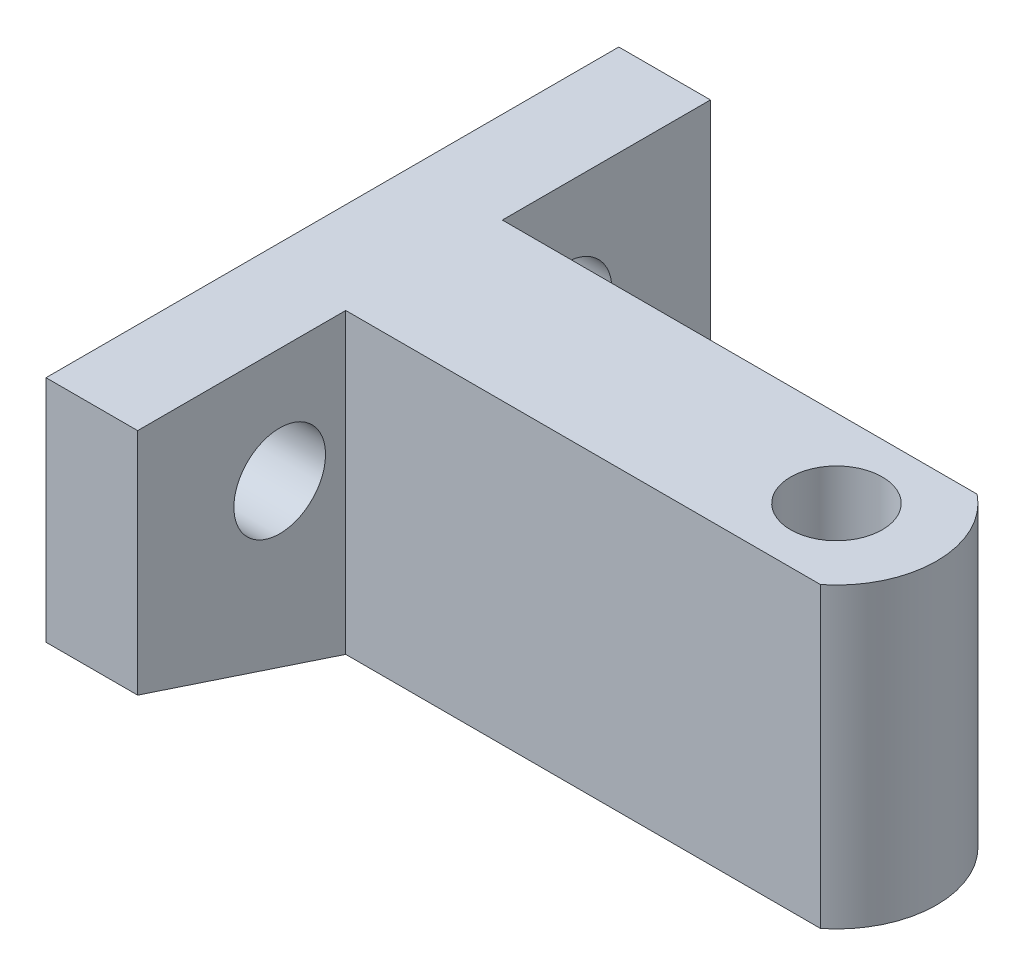
ISO-10303-21;
HEADER;
FILE_DESCRIPTION(('STEP AP214'),'2;1');
FILE_NAME('part.step','',(''),(''),'','','');
FILE_SCHEMA(('AUTOMOTIVE_DESIGN { 1 0 10303 214 1 1 1 1 }'));
ENDSEC;
DATA;
#1=APPLICATION_CONTEXT('core data for automotive mechanical design processes');
#2=APPLICATION_PROTOCOL_DEFINITION('international standard','automotive_design',2000,#1);
#3=PRODUCT_CONTEXT('',#1,'mechanical');
#4=PRODUCT('Part','Part','',(#3));
#5=PRODUCT_RELATED_PRODUCT_CATEGORY('part','',(#4));
#6=PRODUCT_DEFINITION_FORMATION('','',#4);
#7=PRODUCT_DEFINITION_CONTEXT('part definition',#1,'design');
#8=PRODUCT_DEFINITION('design','',#6,#7);
#9=PRODUCT_DEFINITION_SHAPE('','',#8);
#10=(LENGTH_UNIT() NAMED_UNIT(*) SI_UNIT(.MILLI.,.METRE.));
#11=(NAMED_UNIT(*) PLANE_ANGLE_UNIT() SI_UNIT($,.RADIAN.));
#12=(NAMED_UNIT(*) SI_UNIT($,.STERADIAN.) SOLID_ANGLE_UNIT());
#13=UNCERTAINTY_MEASURE_WITH_UNIT(LENGTH_MEASURE(1.E-05),#10,'distance_accuracy_value','');
#14=(GEOMETRIC_REPRESENTATION_CONTEXT(3) GLOBAL_UNCERTAINTY_ASSIGNED_CONTEXT((#13)) GLOBAL_UNIT_ASSIGNED_CONTEXT((#10,
#11,#12)) REPRESENTATION_CONTEXT('',''));
#15=CARTESIAN_POINT('',(0.,0.,0.));
#16=DIRECTION('',(0.,0.,1.));
#17=DIRECTION('',(1.,0.,0.));
#18=AXIS2_PLACEMENT_3D('',#15,#16,#17);
#19=CARTESIAN_POINT('',(4.,0.,0.));
#20=DIRECTION('',(-1.,0.,0.));
#21=DIRECTION('',(0.,0.,1.));
#22=AXIS2_PLACEMENT_3D('',#19,#20,#21);
#23=PLANE('',#22);
#24=CARTESIAN_POINT('',(4.,5.12731481481481,-13.5589810604167));
#25=DIRECTION('',(1.,0.,0.));
#26=DIRECTION('',(0.,0.,-1.));
#27=AXIS2_PLACEMENT_3D('',#24,#25,#26);
#28=CIRCLE('',#27,2.);
#29=CARTESIAN_POINT('',(4.,5.12731481481481,-15.5589810604167));
#30=VERTEX_POINT('',#29);
#31=EDGE_CURVE('E122',#30,#30,#28,.T.);
#32=ORIENTED_EDGE('',*,*,#31,.F.);
#33=EDGE_LOOP('',(#32));
#34=FACE_BOUND('',#33,.T.);
#35=DIRECTION('',(0.,1.,0.));
#36=VECTOR('',#35,1.);
#37=CARTESIAN_POINT('',(4.,-2.87268518518519,-10.7765357543478));
#38=LINE('',#37,#36);
#39=CARTESIAN_POINT('',(4.,-2.87268518518519,-10.7765357543478));
#40=VERTEX_POINT('',#39);
#41=CARTESIAN_POINT('',(4.,10.1273148148148,-10.7765357543478));
#42=VERTEX_POINT('',#41);
#43=EDGE_CURVE('E40',#40,#42,#38,.T.);
#44=ORIENTED_EDGE('',*,*,#43,.F.);
#45=DIRECTION('',(0.,0.313640770390582,-0.949541714275261));
#46=VECTOR('',#45,1.);
#47=CARTESIAN_POINT('',(4.,-2.87268518518519,-10.7765357543478));
#48=LINE('',#47,#46);
#49=CARTESIAN_POINT('',(4.,0.127314814814814,-19.8589810604167));
#50=VERTEX_POINT('',#49);
#51=EDGE_CURVE('E199',#40,#50,#48,.T.);
#52=ORIENTED_EDGE('',*,*,#51,.T.);
#53=DIRECTION('',(0.,1.,0.));
#54=VECTOR('',#53,1.);
#55=CARTESIAN_POINT('',(4.,0.127314814814814,-19.8589810604167));
#56=LINE('',#55,#54);
#57=CARTESIAN_POINT('',(4.,10.1273148148148,-19.8589810604167));
#58=VERTEX_POINT('',#57);
#59=EDGE_CURVE('E140',#50,#58,#56,.T.);
#60=ORIENTED_EDGE('',*,*,#59,.T.);
#61=DIRECTION('',(0.,0.,1.));
#62=VECTOR('',#61,1.);
#63=CARTESIAN_POINT('',(4.,10.1273148148148,5.14101893958334));
#64=LINE('',#63,#62);
#65=EDGE_CURVE('E144',#58,#42,#64,.T.);
#66=ORIENTED_EDGE('',*,*,#65,.T.);
#67=EDGE_LOOP('',(#44,#52,#60,#66));
#68=FACE_BOUND('',#67,.T.);
#69=ADVANCED_FACE('F32',(#34,#68),#23,.F.);
#70=CARTESIAN_POINT('',(4.,5.12731481481481,-1.05898106041667));
#71=DIRECTION('',(1.,0.,0.));
#72=DIRECTION('',(0.,0.,-1.));
#73=AXIS2_PLACEMENT_3D('',#70,#71,#72);
#74=CIRCLE('',#73,2.);
#75=CARTESIAN_POINT('',(4.,5.12731481481481,-3.05898106041667));
#76=VERTEX_POINT('',#75);
#77=EDGE_CURVE('E131',#76,#76,#74,.T.);
#78=ORIENTED_EDGE('',*,*,#77,.F.);
#79=EDGE_LOOP('',(#78));
#80=FACE_BOUND('',#79,.T.);
#81=DIRECTION('',(0.,-1.,0.));
#82=VECTOR('',#81,1.);
#83=CARTESIAN_POINT('',(4.,-2.87268518518519,-3.94142636648558));
#84=LINE('',#83,#82);
#85=CARTESIAN_POINT('',(4.,10.1273148148148,-3.94142636648558));
#86=VERTEX_POINT('',#85);
#87=CARTESIAN_POINT('',(4.,-2.87268518518519,-3.94142636648558));
#88=VERTEX_POINT('',#87);
#89=EDGE_CURVE('E163',#86,#88,#84,.T.);
#90=ORIENTED_EDGE('',*,*,#89,.F.);
#91=CARTESIAN_POINT('',(4.,10.1273148148148,5.14101893958334));
#92=VERTEX_POINT('',#91);
#93=EDGE_CURVE('E143',#86,#92,#64,.T.);
#94=ORIENTED_EDGE('',*,*,#93,.T.);
#95=DIRECTION('',(0.,-1.,0.));
#96=VECTOR('',#95,1.);
#97=CARTESIAN_POINT('',(4.,0.127314814814814,5.14101893958334));
#98=LINE('',#97,#96);
#99=CARTESIAN_POINT('',(4.,0.127314814814814,5.14101893958334));
#100=VERTEX_POINT('',#99);
#101=EDGE_CURVE('E137',#92,#100,#98,.T.);
#102=ORIENTED_EDGE('',*,*,#101,.T.);
#103=DIRECTION('',(0.,-0.313640770390583,-0.949541714275261));
#104=VECTOR('',#103,1.);
#105=CARTESIAN_POINT('',(4.,0.127314814814814,5.14101893958334));
#106=LINE('',#105,#104);
#107=EDGE_CURVE('E192',#100,#88,#106,.T.);
#108=ORIENTED_EDGE('',*,*,#107,.T.);
#109=EDGE_LOOP('',(#90,#94,#102,#108));
#110=FACE_BOUND('',#109,.T.);
#111=ADVANCED_FACE('F196',(#80,#110),#23,.F.);
#112=CARTESIAN_POINT('',(0.,0.,0.));
#113=DIRECTION('',(-1.,0.,0.));
#114=DIRECTION('',(0.,0.,1.));
#115=AXIS2_PLACEMENT_3D('',#112,#113,#114);
#116=PLANE('',#115);
#117=CARTESIAN_POINT('',(0.,5.12731481481481,-1.05898106041667));
#118=DIRECTION('',(1.,0.,0.));
#119=DIRECTION('',(0.,0.,-1.));
#120=AXIS2_PLACEMENT_3D('',#117,#118,#119);
#121=CIRCLE('',#120,2.);
#122=CARTESIAN_POINT('',(0.,5.12731481481481,-3.05898106041667));
#123=VERTEX_POINT('',#122);
#124=EDGE_CURVE('E129',#123,#123,#121,.T.);
#125=ORIENTED_EDGE('',*,*,#124,.T.);
#126=EDGE_LOOP('',(#125));
#127=FACE_BOUND('',#126,.T.);
#128=DIRECTION('',(0.,-1.,0.));
#129=VECTOR('',#128,1.);
#130=CARTESIAN_POINT('',(0.,0.127314814814814,5.14101893958334));
#131=LINE('',#130,#129);
#132=CARTESIAN_POINT('',(0.,10.1273148148148,5.14101893958334));
#133=VERTEX_POINT('',#132);
#134=CARTESIAN_POINT('',(0.,0.127314814814814,5.14101893958334));
#135=VERTEX_POINT('',#134);
#136=EDGE_CURVE('E134',#133,#135,#131,.T.);
#137=ORIENTED_EDGE('',*,*,#136,.F.);
#138=DIRECTION('',(0.,0.,1.));
#139=VECTOR('',#138,1.);
#140=CARTESIAN_POINT('',(0.,10.1273148148148,5.14101893958334));
#141=LINE('',#140,#139);
#142=CARTESIAN_POINT('',(0.,10.1273148148148,-19.8589810604167));
#143=VERTEX_POINT('',#142);
#144=EDGE_CURVE('E141',#143,#133,#141,.T.);
#145=ORIENTED_EDGE('',*,*,#144,.F.);
#146=DIRECTION('',(0.,1.,0.));
#147=VECTOR('',#146,1.);
#148=CARTESIAN_POINT('',(0.,0.127314814814814,-19.8589810604167));
#149=LINE('',#148,#147);
#150=CARTESIAN_POINT('',(0.,0.127314814814814,-19.8589810604167));
#151=VERTEX_POINT('',#150);
#152=EDGE_CURVE('E149',#151,#143,#149,.T.);
#153=ORIENTED_EDGE('',*,*,#152,.F.);
#154=DIRECTION('',(0.,0.313640770390582,-0.949541714275261));
#155=VECTOR('',#154,1.);
#156=CARTESIAN_POINT('',(0.,-2.87268518518519,-10.7765357543478));
#157=LINE('',#156,#155);
#158=CARTESIAN_POINT('',(0.,-2.87268518518519,-10.7765357543478));
#159=VERTEX_POINT('',#158);
#160=EDGE_CURVE('E195',#159,#151,#157,.T.);
#161=ORIENTED_EDGE('',*,*,#160,.F.);
#162=DIRECTION('',(0.,0.,-1.));
#163=VECTOR('',#162,1.);
#164=CARTESIAN_POINT('',(0.,-2.87268518518519,-3.94142636648558));
#165=LINE('',#164,#163);
#166=CARTESIAN_POINT('',(0.,-2.87268518518519,-3.94142636648558));
#167=VERTEX_POINT('',#166);
#168=EDGE_CURVE('E206',#167,#159,#165,.T.);
#169=ORIENTED_EDGE('',*,*,#168,.F.);
#170=DIRECTION('',(0.,-0.313640770390583,-0.949541714275261));
#171=VECTOR('',#170,1.);
#172=CARTESIAN_POINT('',(0.,0.127314814814814,5.14101893958334));
#173=LINE('',#172,#171);
#174=EDGE_CURVE('E194',#135,#167,#173,.T.);
#175=ORIENTED_EDGE('',*,*,#174,.F.);
#176=EDGE_LOOP('',(#137,#145,#153,#161,#169,#175));
#177=FACE_BOUND('',#176,.T.);
#178=CARTESIAN_POINT('',(0.,5.12731481481481,-13.5589810604167));
#179=DIRECTION('',(1.,0.,0.));
#180=DIRECTION('',(0.,0.,-1.));
#181=AXIS2_PLACEMENT_3D('',#178,#179,#180);
#182=CIRCLE('',#181,2.);
#183=CARTESIAN_POINT('',(0.,5.12731481481481,-15.5589810604167));
#184=VERTEX_POINT('',#183);
#185=EDGE_CURVE('E119',#184,#184,#182,.T.);
#186=ORIENTED_EDGE('',*,*,#185,.T.);
#187=EDGE_LOOP('',(#186));
#188=FACE_BOUND('',#187,.T.);
#189=ADVANCED_FACE('F212',(#127,#177,#188),#116,.T.);
#190=CARTESIAN_POINT('',(4.,0.127314814814814,5.14101893958334));
#191=DIRECTION('',(0.,0.,-1.));
#192=DIRECTION('',(0.,1.,0.));
#193=AXIS2_PLACEMENT_3D('',#190,#191,#192);
#194=PLANE('',#193);
#195=ORIENTED_EDGE('',*,*,#136,.T.);
#196=DIRECTION('',(-1.,0.,0.));
#197=VECTOR('',#196,1.);
#198=CARTESIAN_POINT('',(4.,0.127314814814814,5.14101893958334));
#199=LINE('',#198,#197);
#200=EDGE_CURVE('E160',#100,#135,#199,.T.);
#201=ORIENTED_EDGE('',*,*,#200,.F.);
#202=ORIENTED_EDGE('',*,*,#101,.F.);
#203=DIRECTION('',(-1.,0.,0.));
#204=VECTOR('',#203,1.);
#205=CARTESIAN_POINT('',(4.,10.1273148148148,5.14101893958334));
#206=LINE('',#205,#204);
#207=EDGE_CURVE('E146',#92,#133,#206,.T.);
#208=ORIENTED_EDGE('',*,*,#207,.T.);
#209=EDGE_LOOP('',(#195,#201,#202,#208));
#210=FACE_BOUND('',#209,.T.);
#211=ADVANCED_FACE('F34',(#210),#194,.F.);
#212=CARTESIAN_POINT('',(4.,0.127314814814814,-19.8589810604167));
#213=DIRECTION('',(0.,0.,1.));
#214=DIRECTION('',(1.,0.,0.));
#215=AXIS2_PLACEMENT_3D('',#212,#213,#214);
#216=PLANE('',#215);
#217=ORIENTED_EDGE('',*,*,#152,.T.);
#218=DIRECTION('',(-1.,0.,0.));
#219=VECTOR('',#218,1.);
#220=CARTESIAN_POINT('',(4.,10.1273148148148,-19.8589810604167));
#221=LINE('',#220,#219);
#222=EDGE_CURVE('E154',#58,#143,#221,.T.);
#223=ORIENTED_EDGE('',*,*,#222,.F.);
#224=ORIENTED_EDGE('',*,*,#59,.F.);
#225=DIRECTION('',(-1.,0.,0.));
#226=VECTOR('',#225,1.);
#227=CARTESIAN_POINT('',(4.,0.127314814814814,-19.8589810604167));
#228=LINE('',#227,#226);
#229=EDGE_CURVE('E157',#50,#151,#228,.T.);
#230=ORIENTED_EDGE('',*,*,#229,.T.);
#231=EDGE_LOOP('',(#217,#223,#224,#230));
#232=FACE_BOUND('',#231,.T.);
#233=ADVANCED_FACE('F220',(#232),#216,.F.);
#234=CARTESIAN_POINT('',(4.,10.1273148148148,5.14101893958334));
#235=DIRECTION('',(0.,-1.,0.));
#236=DIRECTION('',(0.,0.,-1.));
#237=AXIS2_PLACEMENT_3D('',#234,#235,#236);
#238=PLANE('',#237);
#239=CARTESIAN_POINT('',(22.,10.1273148148148,-7.35898106041667));
#240=DIRECTION('',(0.,1.,0.));
#241=DIRECTION('',(0.,0.,1.));
#242=AXIS2_PLACEMENT_3D('',#239,#240,#241);
#243=CIRCLE('',#242,2.);
#244=CARTESIAN_POINT('',(22.,10.1273148148148,-5.35898106041667));
#245=VERTEX_POINT('',#244);
#246=EDGE_CURVE('E164',#245,#245,#243,.T.);
#247=ORIENTED_EDGE('',*,*,#246,.F.);
#248=EDGE_LOOP('',(#247));
#249=FACE_BOUND('',#248,.T.);
#250=DIRECTION('',(-1.,0.,0.));
#251=VECTOR('',#250,1.);
#252=CARTESIAN_POINT('',(28.,10.1273148148148,-3.94142636648558));
#253=LINE('',#252,#251);
#254=CARTESIAN_POINT('',(24.720702873678,10.1273148148148,-3.94142636648558));
#255=VERTEX_POINT('',#254);
#256=EDGE_CURVE('E53',#255,#86,#253,.T.);
#257=ORIENTED_EDGE('',*,*,#256,.F.);
#258=CARTESIAN_POINT('',(22.,10.1273148148148,-7.35898106041667));
#259=DIRECTION('',(0.,-1.,0.));
#260=DIRECTION('',(0.,0.,1.));
#261=AXIS2_PLACEMENT_3D('',#258,#259,#260);
#262=CIRCLE('',#261,4.36828389792261);
#263=CARTESIAN_POINT('',(24.720702873678,10.1273148148148,-10.7765357543478));
#264=VERTEX_POINT('',#263);
#265=EDGE_CURVE('E104',#264,#255,#262,.T.);
#266=ORIENTED_EDGE('',*,*,#265,.F.);
#267=DIRECTION('',(-1.,0.,0.));
#268=VECTOR('',#267,1.);
#269=CARTESIAN_POINT('',(28.,10.1273148148148,-10.7765357543478));
#270=LINE('',#269,#268);
#271=EDGE_CURVE('E112',#264,#42,#270,.T.);
#272=ORIENTED_EDGE('',*,*,#271,.T.);
#273=ORIENTED_EDGE('',*,*,#65,.F.);
#274=ORIENTED_EDGE('',*,*,#222,.T.);
#275=ORIENTED_EDGE('',*,*,#144,.T.);
#276=ORIENTED_EDGE('',*,*,#207,.F.);
#277=ORIENTED_EDGE('',*,*,#93,.F.);
#278=EDGE_LOOP('',(#257,#266,#272,#273,#274,#275,#276,#277));
#279=FACE_BOUND('',#278,.T.);
#280=ADVANCED_FACE('F110',(#249,#279),#238,.F.);
#281=CARTESIAN_POINT('',(4.,5.12731481481481,-1.05898106041667));
#282=DIRECTION('',(-1.,0.,0.));
#283=DIRECTION('',(0.,0.,1.));
#284=AXIS2_PLACEMENT_3D('',#281,#282,#283);
#285=CYLINDRICAL_SURFACE('',#284,2.);
#286=ORIENTED_EDGE('',*,*,#77,.T.);
#287=EDGE_LOOP('',(#286));
#288=FACE_BOUND('',#287,.T.);
#289=ORIENTED_EDGE('',*,*,#124,.F.);
#290=EDGE_LOOP('',(#289));
#291=FACE_BOUND('',#290,.T.);
#292=ADVANCED_FACE('F241',(#288,#291),#285,.F.);
#293=CARTESIAN_POINT('',(4.,5.12731481481481,-13.5589810604167));
#294=DIRECTION('',(-1.,0.,0.));
#295=DIRECTION('',(0.,0.,1.));
#296=AXIS2_PLACEMENT_3D('',#293,#294,#295);
#297=CYLINDRICAL_SURFACE('',#296,2.);
#298=ORIENTED_EDGE('',*,*,#31,.T.);
#299=EDGE_LOOP('',(#298));
#300=FACE_BOUND('',#299,.T.);
#301=ORIENTED_EDGE('',*,*,#185,.F.);
#302=EDGE_LOOP('',(#301));
#303=FACE_BOUND('',#302,.T.);
#304=ADVANCED_FACE('F249',(#300,#303),#297,.F.);
#305=CARTESIAN_POINT('',(28.,-2.87268518518519,-10.7765357543478));
#306=DIRECTION('',(0.,0.,1.));
#307=DIRECTION('',(1.,0.,0.));
#308=AXIS2_PLACEMENT_3D('',#305,#306,#307);
#309=PLANE('',#308);
#310=ORIENTED_EDGE('',*,*,#271,.F.);
#311=DIRECTION('',(0.,1.,0.));
#312=VECTOR('',#311,1.);
#313=CARTESIAN_POINT('',(24.720702873678,-13.8726851851852,-10.7765357543478));
#314=LINE('',#313,#312);
#315=CARTESIAN_POINT('',(24.720702873678,-2.87268518518519,-10.7765357543478));
#316=VERTEX_POINT('',#315);
#317=EDGE_CURVE('E101',#316,#264,#314,.T.);
#318=ORIENTED_EDGE('',*,*,#317,.F.);
#319=DIRECTION('',(-1.,0.,0.));
#320=VECTOR('',#319,1.);
#321=CARTESIAN_POINT('',(28.,-2.87268518518519,-10.7765357543478));
#322=LINE('',#321,#320);
#323=EDGE_CURVE('E167',#316,#40,#322,.T.);
#324=ORIENTED_EDGE('',*,*,#323,.T.);
#325=ORIENTED_EDGE('',*,*,#43,.T.);
#326=EDGE_LOOP('',(#310,#318,#324,#325));
#327=FACE_BOUND('',#326,.T.);
#328=ADVANCED_FACE('F117',(#327),#309,.F.);
#329=CARTESIAN_POINT('',(28.,-2.87268518518519,-3.94142636648558));
#330=DIRECTION('',(0.,0.,-1.));
#331=DIRECTION('',(-1.,0.,0.));
#332=AXIS2_PLACEMENT_3D('',#329,#330,#331);
#333=PLANE('',#332);
#334=DIRECTION('',(-1.,0.,0.));
#335=VECTOR('',#334,1.);
#336=CARTESIAN_POINT('',(28.,-2.87268518518519,-3.94142636648558));
#337=LINE('',#336,#335);
#338=CARTESIAN_POINT('',(24.720702873678,-2.87268518518519,-3.94142636648558));
#339=VERTEX_POINT('',#338);
#340=EDGE_CURVE('E124',#339,#88,#337,.T.);
#341=ORIENTED_EDGE('',*,*,#340,.F.);
#342=DIRECTION('',(0.,1.,0.));
#343=VECTOR('',#342,1.);
#344=CARTESIAN_POINT('',(24.720702873678,-13.8726851851852,-3.94142636648558));
#345=LINE('',#344,#343);
#346=EDGE_CURVE('E47',#339,#255,#345,.T.);
#347=ORIENTED_EDGE('',*,*,#346,.T.);
#348=ORIENTED_EDGE('',*,*,#256,.T.);
#349=ORIENTED_EDGE('',*,*,#89,.T.);
#350=EDGE_LOOP('',(#341,#347,#348,#349));
#351=FACE_BOUND('',#350,.T.);
#352=ADVANCED_FACE('F186',(#351),#333,.F.);
#353=CARTESIAN_POINT('',(28.,-2.87268518518519,-3.94142636648558));
#354=DIRECTION('',(0.,1.,0.));
#355=DIRECTION('',(0.,0.,1.));
#356=AXIS2_PLACEMENT_3D('',#353,#354,#355);
#357=PLANE('',#356);
#358=CARTESIAN_POINT('',(22.,-2.87268518518519,-7.35898106041667));
#359=DIRECTION('',(0.,1.,0.));
#360=DIRECTION('',(0.,0.,1.));
#361=AXIS2_PLACEMENT_3D('',#358,#359,#360);
#362=CIRCLE('',#361,2.);
#363=CARTESIAN_POINT('',(22.,-2.87268518518519,-5.35898106041667));
#364=VERTEX_POINT('',#363);
#365=EDGE_CURVE('E161',#364,#364,#362,.T.);
#366=ORIENTED_EDGE('',*,*,#365,.T.);
#367=EDGE_LOOP('',(#366));
#368=FACE_BOUND('',#367,.T.);
#369=ORIENTED_EDGE('',*,*,#323,.F.);
#370=CARTESIAN_POINT('',(22.,-2.87268518518519,-7.35898106041667));
#371=DIRECTION('',(0.,1.,0.));
#372=DIRECTION('',(0.,0.,1.));
#373=AXIS2_PLACEMENT_3D('',#370,#371,#372);
#374=CIRCLE('',#373,4.36828389792261);
#375=EDGE_CURVE('E11',#316,#339,#374,.F.);
#376=ORIENTED_EDGE('',*,*,#375,.T.);
#377=ORIENTED_EDGE('',*,*,#340,.T.);
#378=DIRECTION('',(1.,0.,0.));
#379=VECTOR('',#378,1.);
#380=CARTESIAN_POINT('',(0.,-2.87268518518519,-3.94142636648558));
#381=LINE('',#380,#379);
#382=EDGE_CURVE('E175',#167,#88,#381,.T.);
#383=ORIENTED_EDGE('',*,*,#382,.F.);
#384=ORIENTED_EDGE('',*,*,#168,.T.);
#385=DIRECTION('',(1.,0.,0.));
#386=VECTOR('',#385,1.);
#387=CARTESIAN_POINT('',(0.,-2.87268518518519,-10.7765357543478));
#388=LINE('',#387,#386);
#389=EDGE_CURVE('E170',#159,#40,#388,.T.);
#390=ORIENTED_EDGE('',*,*,#389,.T.);
#391=EDGE_LOOP('',(#369,#376,#377,#383,#384,#390));
#392=FACE_BOUND('',#391,.T.);
#393=ADVANCED_FACE('F182',(#368,#392),#357,.F.);
#394=CARTESIAN_POINT('',(22.,-13.8726851851852,-7.35898106041667));
#395=DIRECTION('',(0.,1.,0.));
#396=DIRECTION('',(0.,0.,1.));
#397=AXIS2_PLACEMENT_3D('',#394,#395,#396);
#398=CYLINDRICAL_SURFACE('',#397,2.);
#399=ORIENTED_EDGE('',*,*,#246,.T.);
#400=EDGE_LOOP('',(#399));
#401=FACE_BOUND('',#400,.T.);
#402=ORIENTED_EDGE('',*,*,#365,.F.);
#403=EDGE_LOOP('',(#402));
#404=FACE_BOUND('',#403,.T.);
#405=ADVANCED_FACE('F268',(#401,#404),#398,.F.);
#406=CARTESIAN_POINT('',(0.,-2.87268518518519,-10.7765357543478));
#407=DIRECTION('',(0.,-0.949541714275261,-0.313640770390582));
#408=DIRECTION('',(0.,0.313640770390582,-0.949541714275261));
#409=AXIS2_PLACEMENT_3D('',#406,#407,#408);
#410=PLANE('',#409);
#411=ORIENTED_EDGE('',*,*,#51,.F.);
#412=ORIENTED_EDGE('',*,*,#389,.F.);
#413=ORIENTED_EDGE('',*,*,#160,.T.);
#414=ORIENTED_EDGE('',*,*,#229,.F.);
#415=EDGE_LOOP('',(#411,#412,#413,#414));
#416=FACE_BOUND('',#415,.T.);
#417=ADVANCED_FACE('F217',(#416),#410,.T.);
#418=CARTESIAN_POINT('',(0.,0.127314814814814,5.14101893958334));
#419=DIRECTION('',(0.,-0.949541714275261,0.313640770390583));
#420=DIRECTION('',(0.,-0.313640770390583,-0.949541714275261));
#421=AXIS2_PLACEMENT_3D('',#418,#419,#420);
#422=PLANE('',#421);
#423=ORIENTED_EDGE('',*,*,#107,.F.);
#424=ORIENTED_EDGE('',*,*,#200,.T.);
#425=ORIENTED_EDGE('',*,*,#174,.T.);
#426=ORIENTED_EDGE('',*,*,#382,.T.);
#427=EDGE_LOOP('',(#423,#424,#425,#426));
#428=FACE_BOUND('',#427,.T.);
#429=ADVANCED_FACE('F191',(#428),#422,.T.);
#430=CARTESIAN_POINT('',(22.,-13.8726851851852,-7.35898106041667));
#431=DIRECTION('',(0.,1.,0.));
#432=DIRECTION('',(0.,0.,1.));
#433=AXIS2_PLACEMENT_3D('',#430,#431,#432);
#434=CYLINDRICAL_SURFACE('',#433,4.36828389792261);
#435=ORIENTED_EDGE('',*,*,#317,.T.);
#436=ORIENTED_EDGE('',*,*,#265,.T.);
#437=ORIENTED_EDGE('',*,*,#346,.F.);
#438=ORIENTED_EDGE('',*,*,#375,.F.);
#439=EDGE_LOOP('',(#435,#436,#437,#438));
#440=FACE_BOUND('',#439,.T.);
#441=ADVANCED_FACE('F103',(#440),#434,.T.);
#442=CLOSED_SHELL('',(#69,#111,#189,#211,#233,#280,#292,#304,#328,#352,#393,#405,#417,#429,#441));
#443=MANIFOLD_SOLID_BREP('B2',#442);
#444=ADVANCED_BREP_SHAPE_REPRESENTATION('',(#18,#443),#14);
#445=SHAPE_DEFINITION_REPRESENTATION(#9,#444);
ENDSEC;
END-ISO-10303-21;
